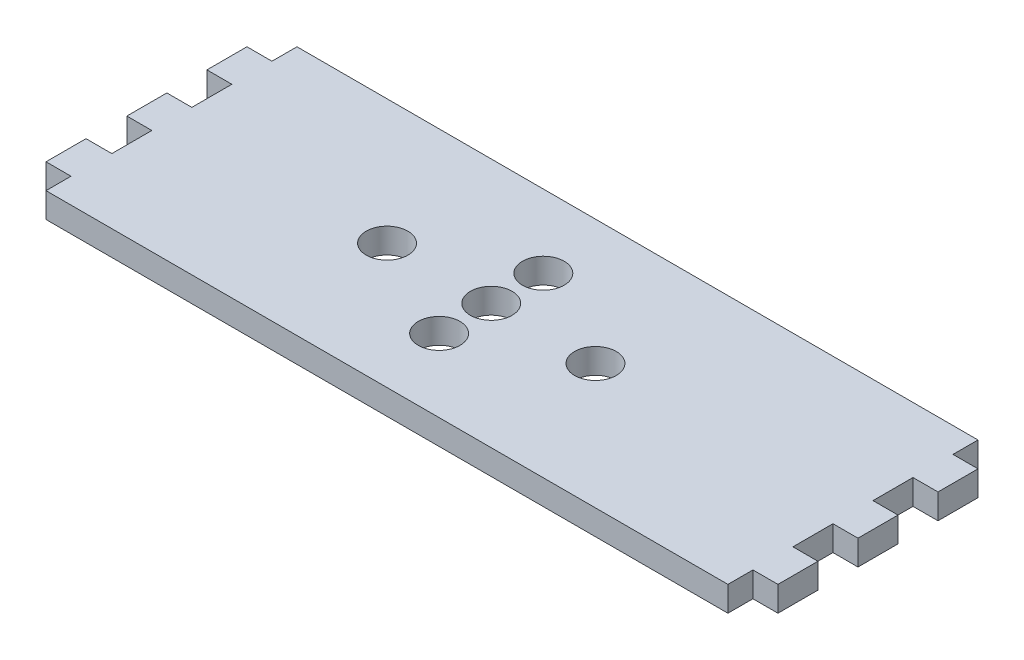
ISO-10303-21;
HEADER;
FILE_DESCRIPTION(('STEP AP214'),'2;1');
FILE_NAME('part.step','',(''),(''),'','','');
FILE_SCHEMA(('AUTOMOTIVE_DESIGN { 1 0 10303 214 1 1 1 1 }'));
ENDSEC;
DATA;
#1=APPLICATION_CONTEXT('core data for automotive mechanical design processes');
#2=APPLICATION_PROTOCOL_DEFINITION('international standard','automotive_design',2000,#1);
#3=PRODUCT_CONTEXT('',#1,'mechanical');
#4=PRODUCT('Part','Part','',(#3));
#5=PRODUCT_RELATED_PRODUCT_CATEGORY('part','',(#4));
#6=PRODUCT_DEFINITION_FORMATION('','',#4);
#7=PRODUCT_DEFINITION_CONTEXT('part definition',#1,'design');
#8=PRODUCT_DEFINITION('design','',#6,#7);
#9=PRODUCT_DEFINITION_SHAPE('','',#8);
#10=(LENGTH_UNIT() NAMED_UNIT(*) SI_UNIT(.MILLI.,.METRE.));
#11=(NAMED_UNIT(*) PLANE_ANGLE_UNIT() SI_UNIT($,.RADIAN.));
#12=(NAMED_UNIT(*) SI_UNIT($,.STERADIAN.) SOLID_ANGLE_UNIT());
#13=UNCERTAINTY_MEASURE_WITH_UNIT(LENGTH_MEASURE(1.E-05),#10,'distance_accuracy_value','');
#14=(GEOMETRIC_REPRESENTATION_CONTEXT(3) GLOBAL_UNCERTAINTY_ASSIGNED_CONTEXT((#13)) GLOBAL_UNIT_ASSIGNED_CONTEXT((#10,
#11,#12)) REPRESENTATION_CONTEXT('',''));
#15=CARTESIAN_POINT('',(0.,0.,0.));
#16=DIRECTION('',(0.,0.,1.));
#17=DIRECTION('',(1.,0.,0.));
#18=AXIS2_PLACEMENT_3D('',#15,#16,#17);
#19=CARTESIAN_POINT('',(0.,3.,0.));
#20=DIRECTION('',(0.,1.,0.));
#21=DIRECTION('',(0.,0.,1.));
#22=AXIS2_PLACEMENT_3D('',#19,#20,#21);
#23=PLANE('',#22);
#24=CARTESIAN_POINT('',(-16.6212713440349,3.,10.3559258979495));
#25=DIRECTION('',(0.,1.,0.));
#26=DIRECTION('',(0.,0.,1.));
#27=AXIS2_PLACEMENT_3D('',#24,#25,#26);
#28=CIRCLE('',#27,2.5);
#29=CARTESIAN_POINT('',(-16.6212713440349,3.,12.8559258979495));
#30=VERTEX_POINT('',#29);
#31=EDGE_CURVE('E592',#30,#30,#28,.T.);
#32=ORIENTED_EDGE('',*,*,#31,.F.);
#33=EDGE_LOOP('',(#32));
#34=FACE_BOUND('',#33,.T.);
#35=CARTESIAN_POINT('',(-16.6212713440349,3.,-2.14407410205047));
#36=DIRECTION('',(0.,1.,0.));
#37=DIRECTION('',(0.,0.,1.));
#38=AXIS2_PLACEMENT_3D('',#35,#36,#37);
#39=CIRCLE('',#38,2.5);
#40=CARTESIAN_POINT('',(-16.6212713440349,3.,0.355925897949527));
#41=VERTEX_POINT('',#40);
#42=EDGE_CURVE('E608',#41,#41,#39,.T.);
#43=ORIENTED_EDGE('',*,*,#42,.F.);
#44=EDGE_LOOP('',(#43));
#45=FACE_BOUND('',#44,.T.);
#46=DIRECTION('',(0.,0.,1.));
#47=VECTOR('',#46,1.);
#48=CARTESIAN_POINT('',(-57.9249234536885,3.,-7.89384586424679));
#49=LINE('',#48,#47);
#50=CARTESIAN_POINT('',(-57.9249234536885,3.,-7.89384586424679));
#51=VERTEX_POINT('',#50);
#52=CARTESIAN_POINT('',(-57.9249234536885,3.,-3.09384586424679));
#53=VERTEX_POINT('',#52);
#54=EDGE_CURVE('E344',#51,#53,#49,.T.);
#55=ORIENTED_EDGE('',*,*,#54,.T.);
#56=DIRECTION('',(1.,0.,0.));
#57=VECTOR('',#56,1.);
#58=CARTESIAN_POINT('',(-57.9249234536885,3.,-3.09384586424679));
#59=LINE('',#58,#57);
#60=CARTESIAN_POINT('',(-54.9341826975603,3.,-3.09384586424679));
#61=VERTEX_POINT('',#60);
#62=EDGE_CURVE('E160',#53,#61,#59,.T.);
#63=ORIENTED_EDGE('',*,*,#62,.T.);
#64=DIRECTION('',(0.,0.,1.));
#65=VECTOR('',#64,1.);
#66=CARTESIAN_POINT('',(-54.9341826975603,3.,-3.09384586424679));
#67=LINE('',#66,#65);
#68=CARTESIAN_POINT('',(-54.9341826975603,3.,1.70615413575321));
#69=VERTEX_POINT('',#68);
#70=EDGE_CURVE('E445',#61,#69,#67,.T.);
#71=ORIENTED_EDGE('',*,*,#70,.T.);
#72=DIRECTION('',(-1.,0.,0.));
#73=VECTOR('',#72,1.);
#74=CARTESIAN_POINT('',(-54.9341826975603,3.,1.70615413575321));
#75=LINE('',#74,#73);
#76=CARTESIAN_POINT('',(-57.9312240082668,3.,1.70615413575321));
#77=VERTEX_POINT('',#76);
#78=EDGE_CURVE('E465',#69,#77,#75,.T.);
#79=ORIENTED_EDGE('',*,*,#78,.T.);
#80=DIRECTION('',(0.,0.,1.));
#81=VECTOR('',#80,1.);
#82=CARTESIAN_POINT('',(-57.9312240082668,3.,1.70615413575321));
#83=LINE('',#82,#81);
#84=CARTESIAN_POINT('',(-57.9312240082668,3.,6.50615413575321));
#85=VERTEX_POINT('',#84);
#86=EDGE_CURVE('E461',#77,#85,#83,.T.);
#87=ORIENTED_EDGE('',*,*,#86,.T.);
#88=DIRECTION('',(1.,0.,0.));
#89=VECTOR('',#88,1.);
#90=CARTESIAN_POINT('',(-57.9312240082668,3.,6.50615413575321));
#91=LINE('',#90,#89);
#92=CARTESIAN_POINT('',(-54.9312240082669,3.,6.50615413575321));
#93=VERTEX_POINT('',#92);
#94=EDGE_CURVE('E464',#85,#93,#91,.T.);
#95=ORIENTED_EDGE('',*,*,#94,.T.);
#96=DIRECTION('',(0.,0.,1.));
#97=VECTOR('',#96,1.);
#98=CARTESIAN_POINT('',(-54.9312240082669,3.,6.50615413575321));
#99=LINE('',#98,#97);
#100=CARTESIAN_POINT('',(-54.9312240082669,3.,11.3061541357532));
#101=VERTEX_POINT('',#100);
#102=EDGE_CURVE('E469',#93,#101,#99,.T.);
#103=ORIENTED_EDGE('',*,*,#102,.T.);
#104=DIRECTION('',(-1.,0.,0.));
#105=VECTOR('',#104,1.);
#106=CARTESIAN_POINT('',(-54.9312240082669,3.,11.3061541357532));
#107=LINE('',#106,#105);
#108=CARTESIAN_POINT('',(-58.0295913211727,3.,11.3061541357532));
#109=VERTEX_POINT('',#108);
#110=EDGE_CURVE('E476',#101,#109,#107,.T.);
#111=ORIENTED_EDGE('',*,*,#110,.T.);
#112=DIRECTION('',(0.,0.,1.));
#113=VECTOR('',#112,1.);
#114=CARTESIAN_POINT('',(-58.0295913211727,3.,11.3061541357532));
#115=LINE('',#114,#113);
#116=CARTESIAN_POINT('',(-58.0295913211727,3.,16.1059258979495));
#117=VERTEX_POINT('',#116);
#118=EDGE_CURVE('E479',#109,#117,#115,.T.);
#119=ORIENTED_EDGE('',*,*,#118,.T.);
#120=DIRECTION('',(1.,0.,0.));
#121=VECTOR('',#120,1.);
#122=CARTESIAN_POINT('',(-55.0295913211727,3.,16.1059258979495));
#123=LINE('',#122,#121);
#124=CARTESIAN_POINT('',(-55.0295913211727,3.,16.1059258979495));
#125=VERTEX_POINT('',#124);
#126=EDGE_CURVE('E482',#117,#125,#123,.T.);
#127=ORIENTED_EDGE('',*,*,#126,.T.);
#128=DIRECTION('',(0.,0.,1.));
#129=VECTOR('',#128,1.);
#130=CARTESIAN_POINT('',(-55.0295913211727,3.,19.1059258979495));
#131=LINE('',#130,#129);
#132=CARTESIAN_POINT('',(-55.0295913211727,3.,19.1059258979495));
#133=VERTEX_POINT('',#132);
#134=EDGE_CURVE('E485',#125,#133,#131,.T.);
#135=ORIENTED_EDGE('',*,*,#134,.T.);
#136=DIRECTION('',(1.,0.,0.));
#137=VECTOR('',#136,1.);
#138=CARTESIAN_POINT('',(26.7704086788273,3.,19.1059258979495));
#139=LINE('',#138,#137);
#140=CARTESIAN_POINT('',(26.7704086788273,3.,19.1059258979495));
#141=VERTEX_POINT('',#140);
#142=EDGE_CURVE('E488',#133,#141,#139,.T.);
#143=ORIENTED_EDGE('',*,*,#142,.T.);
#144=DIRECTION('',(0.,0.,-1.));
#145=VECTOR('',#144,1.);
#146=CARTESIAN_POINT('',(26.7704086788273,3.,16.1059258979495));
#147=LINE('',#146,#145);
#148=CARTESIAN_POINT('',(26.7704086788273,3.,16.1059258979495));
#149=VERTEX_POINT('',#148);
#150=EDGE_CURVE('E491',#141,#149,#147,.T.);
#151=ORIENTED_EDGE('',*,*,#150,.T.);
#152=DIRECTION('',(1.,0.,0.));
#153=VECTOR('',#152,1.);
#154=CARTESIAN_POINT('',(29.7704086788273,3.,16.1059258979495));
#155=LINE('',#154,#153);
#156=CARTESIAN_POINT('',(29.7704086788273,3.,16.1059258979495));
#157=VERTEX_POINT('',#156);
#158=EDGE_CURVE('E494',#149,#157,#155,.T.);
#159=ORIENTED_EDGE('',*,*,#158,.T.);
#160=DIRECTION('',(0.,0.,-1.));
#161=VECTOR('',#160,1.);
#162=CARTESIAN_POINT('',(29.7704086788273,3.,11.3061541357532));
#163=LINE('',#162,#161);
#164=CARTESIAN_POINT('',(29.7704086788273,3.,11.3061541357532));
#165=VERTEX_POINT('',#164);
#166=EDGE_CURVE('E497',#157,#165,#163,.T.);
#167=ORIENTED_EDGE('',*,*,#166,.T.);
#168=DIRECTION('',(-1.,0.,0.));
#169=VECTOR('',#168,1.);
#170=CARTESIAN_POINT('',(26.7704086788273,3.,11.3061541357532));
#171=LINE('',#170,#169);
#172=CARTESIAN_POINT('',(26.7704086788273,3.,11.3061541357532));
#173=VERTEX_POINT('',#172);
#174=EDGE_CURVE('E500',#165,#173,#171,.T.);
#175=ORIENTED_EDGE('',*,*,#174,.T.);
#176=DIRECTION('',(0.,0.,-1.));
#177=VECTOR('',#176,1.);
#178=CARTESIAN_POINT('',(26.7704086788273,3.,6.50615413575321));
#179=LINE('',#178,#177);
#180=CARTESIAN_POINT('',(26.7704086788273,3.,6.50615413575321));
#181=VERTEX_POINT('',#180);
#182=EDGE_CURVE('E503',#173,#181,#179,.T.);
#183=ORIENTED_EDGE('',*,*,#182,.T.);
#184=DIRECTION('',(1.,0.,0.));
#185=VECTOR('',#184,1.);
#186=CARTESIAN_POINT('',(29.7704086788273,3.,6.50615413575321));
#187=LINE('',#186,#185);
#188=CARTESIAN_POINT('',(29.7704086788273,3.,6.50615413575321));
#189=VERTEX_POINT('',#188);
#190=EDGE_CURVE('E506',#181,#189,#187,.T.);
#191=ORIENTED_EDGE('',*,*,#190,.T.);
#192=DIRECTION('',(0.,0.,-1.));
#193=VECTOR('',#192,1.);
#194=CARTESIAN_POINT('',(29.7704086788273,3.,1.70615413575321));
#195=LINE('',#194,#193);
#196=CARTESIAN_POINT('',(29.7704086788273,3.,1.70615413575321));
#197=VERTEX_POINT('',#196);
#198=EDGE_CURVE('E509',#189,#197,#195,.T.);
#199=ORIENTED_EDGE('',*,*,#198,.T.);
#200=DIRECTION('',(-1.,0.,0.));
#201=VECTOR('',#200,1.);
#202=CARTESIAN_POINT('',(26.7704086788273,3.,1.70615413575321));
#203=LINE('',#202,#201);
#204=CARTESIAN_POINT('',(26.7704086788273,3.,1.70615413575321));
#205=VERTEX_POINT('',#204);
#206=EDGE_CURVE('E512',#197,#205,#203,.T.);
#207=ORIENTED_EDGE('',*,*,#206,.T.);
#208=DIRECTION('',(0.,0.,-1.));
#209=VECTOR('',#208,1.);
#210=CARTESIAN_POINT('',(26.7704086788273,3.,-3.09384586424679));
#211=LINE('',#210,#209);
#212=CARTESIAN_POINT('',(26.7704086788273,3.,-3.09384586424679));
#213=VERTEX_POINT('',#212);
#214=EDGE_CURVE('E515',#205,#213,#211,.T.);
#215=ORIENTED_EDGE('',*,*,#214,.T.);
#216=DIRECTION('',(1.,0.,0.));
#217=VECTOR('',#216,1.);
#218=CARTESIAN_POINT('',(29.7683925013622,3.,-3.09384586424679));
#219=LINE('',#218,#217);
#220=CARTESIAN_POINT('',(29.7683925013622,3.,-3.09384586424679));
#221=VERTEX_POINT('',#220);
#222=EDGE_CURVE('E518',#213,#221,#219,.T.);
#223=ORIENTED_EDGE('',*,*,#222,.T.);
#224=DIRECTION('',(0.,0.,-1.));
#225=VECTOR('',#224,1.);
#226=CARTESIAN_POINT('',(29.7683925013622,3.,-7.89384586424679));
#227=LINE('',#226,#225);
#228=CARTESIAN_POINT('',(29.7683925013622,3.,-7.89384586424679));
#229=VERTEX_POINT('',#228);
#230=EDGE_CURVE('E521',#221,#229,#227,.T.);
#231=ORIENTED_EDGE('',*,*,#230,.T.);
#232=DIRECTION('',(-1.,0.,0.));
#233=VECTOR('',#232,1.);
#234=CARTESIAN_POINT('',(26.7683925013622,3.,-7.89384586424679));
#235=LINE('',#234,#233);
#236=CARTESIAN_POINT('',(26.7683925013622,3.,-7.89384586424679));
#237=VERTEX_POINT('',#236);
#238=EDGE_CURVE('E524',#229,#237,#235,.T.);
#239=ORIENTED_EDGE('',*,*,#238,.T.);
#240=DIRECTION('',(0.,0.,-1.));
#241=VECTOR('',#240,1.);
#242=CARTESIAN_POINT('',(26.7683925013622,3.,-10.8938458642468));
#243=LINE('',#242,#241);
#244=CARTESIAN_POINT('',(26.7683925013622,3.,-10.8938458642468));
#245=VERTEX_POINT('',#244);
#246=EDGE_CURVE('E239',#237,#245,#243,.T.);
#247=ORIENTED_EDGE('',*,*,#246,.T.);
#248=DIRECTION('',(-1.,0.,0.));
#249=VECTOR('',#248,1.);
#250=CARTESIAN_POINT('',(-54.9249234536885,3.,-10.8938458642468));
#251=LINE('',#250,#249);
#252=CARTESIAN_POINT('',(-54.9249234536885,3.,-10.8938458642468));
#253=VERTEX_POINT('',#252);
#254=EDGE_CURVE('E233',#245,#253,#251,.T.);
#255=ORIENTED_EDGE('',*,*,#254,.T.);
#256=DIRECTION('',(0.,0.,1.));
#257=VECTOR('',#256,1.);
#258=CARTESIAN_POINT('',(-54.9249234536885,3.,-7.89384586424679));
#259=LINE('',#258,#257);
#260=CARTESIAN_POINT('',(-54.9249234536885,3.,-7.89384586424679));
#261=VERTEX_POINT('',#260);
#262=EDGE_CURVE('E237',#253,#261,#259,.T.);
#263=ORIENTED_EDGE('',*,*,#262,.T.);
#264=DIRECTION('',(-1.,0.,0.));
#265=VECTOR('',#264,1.);
#266=CARTESIAN_POINT('',(-57.9249234536885,3.,-7.89384586424679));
#267=LINE('',#266,#265);
#268=EDGE_CURVE('E57',#261,#51,#267,.T.);
#269=ORIENTED_EDGE('',*,*,#268,.T.);
#270=EDGE_LOOP('',(#55,#63,#71,#79,#87,#95,#103,#111,#119,#127,#135,#143,#151,#159,#167,#175,
#183,#191,#199,#207,#215,#223,#231,#239,#247,#255,#263,#269));
#271=FACE_BOUND('',#270,.T.);
#272=CARTESIAN_POINT('',(-16.6212713440349,3.,4.10592589794953));
#273=DIRECTION('',(0.,1.,0.));
#274=DIRECTION('',(0.,0.,1.));
#275=AXIS2_PLACEMENT_3D('',#272,#273,#274);
#276=CIRCLE('',#275,2.5);
#277=CARTESIAN_POINT('',(-16.6212713440349,3.,6.60592589794953));
#278=VERTEX_POINT('',#277);
#279=EDGE_CURVE('E266',#278,#278,#276,.T.);
#280=ORIENTED_EDGE('',*,*,#279,.F.);
#281=EDGE_LOOP('',(#280));
#282=FACE_BOUND('',#281,.T.);
#283=CARTESIAN_POINT('',(-4.12127134403486,3.,4.10592589794953));
#284=DIRECTION('',(0.,1.,0.));
#285=DIRECTION('',(0.,0.,1.));
#286=AXIS2_PLACEMENT_3D('',#283,#284,#285);
#287=CIRCLE('',#286,2.49999999723243);
#288=CARTESIAN_POINT('',(-4.12127134403486,3.,6.60592589518195));
#289=VERTEX_POINT('',#288);
#290=EDGE_CURVE('E600',#289,#289,#287,.T.);
#291=ORIENTED_EDGE('',*,*,#290,.F.);
#292=EDGE_LOOP('',(#291));
#293=FACE_BOUND('',#292,.T.);
#294=CARTESIAN_POINT('',(-29.1212713440349,3.,4.10592589794953));
#295=DIRECTION('',(0.,1.,0.));
#296=DIRECTION('',(0.,0.,1.));
#297=AXIS2_PLACEMENT_3D('',#294,#295,#296);
#298=CIRCLE('',#297,2.50000000276757);
#299=CARTESIAN_POINT('',(-29.1212713440349,3.,6.6059259007171));
#300=VERTEX_POINT('',#299);
#301=EDGE_CURVE('E581',#300,#300,#298,.T.);
#302=ORIENTED_EDGE('',*,*,#301,.F.);
#303=EDGE_LOOP('',(#302));
#304=FACE_BOUND('',#303,.T.);
#305=ADVANCED_FACE('F39',(#34,#45,#271,#282,#293,#304),#23,.T.);
#306=CARTESIAN_POINT('',(0.,0.,0.));
#307=DIRECTION('',(0.,1.,0.));
#308=DIRECTION('',(0.,0.,1.));
#309=AXIS2_PLACEMENT_3D('',#306,#307,#308);
#310=PLANE('',#309);
#311=DIRECTION('',(0.,0.,1.));
#312=VECTOR('',#311,1.);
#313=CARTESIAN_POINT('',(-57.9249234536885,0.,-7.89384586424679));
#314=LINE('',#313,#312);
#315=CARTESIAN_POINT('',(-57.9249234536885,0.,-7.89384586424679));
#316=VERTEX_POINT('',#315);
#317=CARTESIAN_POINT('',(-57.9249234536885,0.,-3.09384586424679));
#318=VERTEX_POINT('',#317);
#319=EDGE_CURVE('E261',#316,#318,#314,.T.);
#320=ORIENTED_EDGE('',*,*,#319,.F.);
#321=DIRECTION('',(-1.,0.,0.));
#322=VECTOR('',#321,1.);
#323=CARTESIAN_POINT('',(-57.9249234536885,0.,-7.89384586424679));
#324=LINE('',#323,#322);
#325=CARTESIAN_POINT('',(-54.9249234536885,0.,-7.89384586424679));
#326=VERTEX_POINT('',#325);
#327=EDGE_CURVE('E152',#326,#316,#324,.T.);
#328=ORIENTED_EDGE('',*,*,#327,.F.);
#329=DIRECTION('',(0.,0.,1.));
#330=VECTOR('',#329,1.);
#331=CARTESIAN_POINT('',(-54.9249234536885,0.,-7.89384586424679));
#332=LINE('',#331,#330);
#333=CARTESIAN_POINT('',(-54.9249234536885,0.,-10.8938458642468));
#334=VERTEX_POINT('',#333);
#335=EDGE_CURVE('E146',#334,#326,#332,.T.);
#336=ORIENTED_EDGE('',*,*,#335,.F.);
#337=DIRECTION('',(-1.,0.,0.));
#338=VECTOR('',#337,1.);
#339=CARTESIAN_POINT('',(-54.9249234536885,0.,-10.8938458642468));
#340=LINE('',#339,#338);
#341=CARTESIAN_POINT('',(26.7683925013622,0.,-10.8938458642468));
#342=VERTEX_POINT('',#341);
#343=EDGE_CURVE('E248',#342,#334,#340,.T.);
#344=ORIENTED_EDGE('',*,*,#343,.F.);
#345=DIRECTION('',(0.,0.,-1.));
#346=VECTOR('',#345,1.);
#347=CARTESIAN_POINT('',(26.7683925013622,0.,-10.8938458642468));
#348=LINE('',#347,#346);
#349=CARTESIAN_POINT('',(26.7683925013622,0.,-7.89384586424679));
#350=VERTEX_POINT('',#349);
#351=EDGE_CURVE('E335',#350,#342,#348,.T.);
#352=ORIENTED_EDGE('',*,*,#351,.F.);
#353=DIRECTION('',(-1.,0.,0.));
#354=VECTOR('',#353,1.);
#355=CARTESIAN_POINT('',(26.7683925013622,0.,-7.89384586424679));
#356=LINE('',#355,#354);
#357=CARTESIAN_POINT('',(29.7683925013622,0.,-7.89384586424679));
#358=VERTEX_POINT('',#357);
#359=EDGE_CURVE('E332',#358,#350,#356,.T.);
#360=ORIENTED_EDGE('',*,*,#359,.F.);
#361=DIRECTION('',(0.,0.,-1.));
#362=VECTOR('',#361,1.);
#363=CARTESIAN_POINT('',(29.7683925013622,0.,-7.89384586424679));
#364=LINE('',#363,#362);
#365=CARTESIAN_POINT('',(29.7683925013622,0.,-3.09384586424679));
#366=VERTEX_POINT('',#365);
#367=EDGE_CURVE('E329',#366,#358,#364,.T.);
#368=ORIENTED_EDGE('',*,*,#367,.F.);
#369=DIRECTION('',(1.,0.,0.));
#370=VECTOR('',#369,1.);
#371=CARTESIAN_POINT('',(29.7683925013622,0.,-3.09384586424679));
#372=LINE('',#371,#370);
#373=CARTESIAN_POINT('',(26.7704086788273,0.,-3.09384586424679));
#374=VERTEX_POINT('',#373);
#375=EDGE_CURVE('E326',#374,#366,#372,.T.);
#376=ORIENTED_EDGE('',*,*,#375,.F.);
#377=DIRECTION('',(0.,0.,-1.));
#378=VECTOR('',#377,1.);
#379=CARTESIAN_POINT('',(26.7704086788273,0.,-3.09384586424679));
#380=LINE('',#379,#378);
#381=CARTESIAN_POINT('',(26.7704086788273,0.,1.70615413575321));
#382=VERTEX_POINT('',#381);
#383=EDGE_CURVE('E323',#382,#374,#380,.T.);
#384=ORIENTED_EDGE('',*,*,#383,.F.);
#385=DIRECTION('',(-1.,0.,0.));
#386=VECTOR('',#385,1.);
#387=CARTESIAN_POINT('',(26.7704086788273,0.,1.70615413575321));
#388=LINE('',#387,#386);
#389=CARTESIAN_POINT('',(29.7704086788273,0.,1.70615413575321));
#390=VERTEX_POINT('',#389);
#391=EDGE_CURVE('E320',#390,#382,#388,.T.);
#392=ORIENTED_EDGE('',*,*,#391,.F.);
#393=DIRECTION('',(0.,0.,-1.));
#394=VECTOR('',#393,1.);
#395=CARTESIAN_POINT('',(29.7704086788273,0.,1.70615413575321));
#396=LINE('',#395,#394);
#397=CARTESIAN_POINT('',(29.7704086788273,0.,6.50615413575321));
#398=VERTEX_POINT('',#397);
#399=EDGE_CURVE('E317',#398,#390,#396,.T.);
#400=ORIENTED_EDGE('',*,*,#399,.F.);
#401=DIRECTION('',(1.,0.,0.));
#402=VECTOR('',#401,1.);
#403=CARTESIAN_POINT('',(29.7704086788273,0.,6.50615413575321));
#404=LINE('',#403,#402);
#405=CARTESIAN_POINT('',(26.7704086788273,0.,6.50615413575321));
#406=VERTEX_POINT('',#405);
#407=EDGE_CURVE('E314',#406,#398,#404,.T.);
#408=ORIENTED_EDGE('',*,*,#407,.F.);
#409=DIRECTION('',(0.,0.,-1.));
#410=VECTOR('',#409,1.);
#411=CARTESIAN_POINT('',(26.7704086788273,0.,6.50615413575321));
#412=LINE('',#411,#410);
#413=CARTESIAN_POINT('',(26.7704086788273,0.,11.3061541357532));
#414=VERTEX_POINT('',#413);
#415=EDGE_CURVE('E311',#414,#406,#412,.T.);
#416=ORIENTED_EDGE('',*,*,#415,.F.);
#417=DIRECTION('',(-1.,0.,0.));
#418=VECTOR('',#417,1.);
#419=CARTESIAN_POINT('',(26.7704086788273,0.,11.3061541357532));
#420=LINE('',#419,#418);
#421=CARTESIAN_POINT('',(29.7704086788273,0.,11.3061541357532));
#422=VERTEX_POINT('',#421);
#423=EDGE_CURVE('E308',#422,#414,#420,.T.);
#424=ORIENTED_EDGE('',*,*,#423,.F.);
#425=DIRECTION('',(0.,0.,-1.));
#426=VECTOR('',#425,1.);
#427=CARTESIAN_POINT('',(29.7704086788273,0.,11.3061541357532));
#428=LINE('',#427,#426);
#429=CARTESIAN_POINT('',(29.7704086788273,0.,16.1059258979495));
#430=VERTEX_POINT('',#429);
#431=EDGE_CURVE('E305',#430,#422,#428,.T.);
#432=ORIENTED_EDGE('',*,*,#431,.F.);
#433=DIRECTION('',(1.,0.,0.));
#434=VECTOR('',#433,1.);
#435=CARTESIAN_POINT('',(29.7704086788273,0.,16.1059258979495));
#436=LINE('',#435,#434);
#437=CARTESIAN_POINT('',(26.7704086788273,0.,16.1059258979495));
#438=VERTEX_POINT('',#437);
#439=EDGE_CURVE('E302',#438,#430,#436,.T.);
#440=ORIENTED_EDGE('',*,*,#439,.F.);
#441=DIRECTION('',(0.,0.,-1.));
#442=VECTOR('',#441,1.);
#443=CARTESIAN_POINT('',(26.7704086788273,0.,16.1059258979495));
#444=LINE('',#443,#442);
#445=CARTESIAN_POINT('',(26.7704086788273,0.,19.1059258979495));
#446=VERTEX_POINT('',#445);
#447=EDGE_CURVE('E299',#446,#438,#444,.T.);
#448=ORIENTED_EDGE('',*,*,#447,.F.);
#449=DIRECTION('',(1.,0.,0.));
#450=VECTOR('',#449,1.);
#451=CARTESIAN_POINT('',(26.7704086788273,0.,19.1059258979495));
#452=LINE('',#451,#450);
#453=CARTESIAN_POINT('',(-55.0295913211727,0.,19.1059258979495));
#454=VERTEX_POINT('',#453);
#455=EDGE_CURVE('E296',#454,#446,#452,.T.);
#456=ORIENTED_EDGE('',*,*,#455,.F.);
#457=DIRECTION('',(0.,0.,1.));
#458=VECTOR('',#457,1.);
#459=CARTESIAN_POINT('',(-55.0295913211727,0.,19.1059258979495));
#460=LINE('',#459,#458);
#461=CARTESIAN_POINT('',(-55.0295913211727,0.,16.1059258979495));
#462=VERTEX_POINT('',#461);
#463=EDGE_CURVE('E293',#462,#454,#460,.T.);
#464=ORIENTED_EDGE('',*,*,#463,.F.);
#465=DIRECTION('',(1.,0.,0.));
#466=VECTOR('',#465,1.);
#467=CARTESIAN_POINT('',(-55.0295913211727,0.,16.1059258979495));
#468=LINE('',#467,#466);
#469=CARTESIAN_POINT('',(-58.0295913211727,0.,16.1059258979495));
#470=VERTEX_POINT('',#469);
#471=EDGE_CURVE('E290',#470,#462,#468,.T.);
#472=ORIENTED_EDGE('',*,*,#471,.F.);
#473=DIRECTION('',(0.,0.,1.));
#474=VECTOR('',#473,1.);
#475=CARTESIAN_POINT('',(-58.0295913211727,0.,11.3061541357532));
#476=LINE('',#475,#474);
#477=CARTESIAN_POINT('',(-58.0295913211727,0.,11.3061541357532));
#478=VERTEX_POINT('',#477);
#479=EDGE_CURVE('E287',#478,#470,#476,.T.);
#480=ORIENTED_EDGE('',*,*,#479,.F.);
#481=DIRECTION('',(-1.,0.,0.));
#482=VECTOR('',#481,1.);
#483=CARTESIAN_POINT('',(-54.9312240082669,0.,11.3061541357532));
#484=LINE('',#483,#482);
#485=CARTESIAN_POINT('',(-54.9312240082669,0.,11.3061541357532));
#486=VERTEX_POINT('',#485);
#487=EDGE_CURVE('E284',#486,#478,#484,.T.);
#488=ORIENTED_EDGE('',*,*,#487,.F.);
#489=DIRECTION('',(0.,0.,1.));
#490=VECTOR('',#489,1.);
#491=CARTESIAN_POINT('',(-54.9312240082669,0.,6.50615413575321));
#492=LINE('',#491,#490);
#493=CARTESIAN_POINT('',(-54.9312240082669,0.,6.50615413575321));
#494=VERTEX_POINT('',#493);
#495=EDGE_CURVE('E281',#494,#486,#492,.T.);
#496=ORIENTED_EDGE('',*,*,#495,.F.);
#497=DIRECTION('',(1.,0.,0.));
#498=VECTOR('',#497,1.);
#499=CARTESIAN_POINT('',(-57.9312240082668,0.,6.50615413575321));
#500=LINE('',#499,#498);
#501=CARTESIAN_POINT('',(-57.9312240082668,0.,6.50615413575321));
#502=VERTEX_POINT('',#501);
#503=EDGE_CURVE('E278',#502,#494,#500,.T.);
#504=ORIENTED_EDGE('',*,*,#503,.F.);
#505=DIRECTION('',(0.,0.,1.));
#506=VECTOR('',#505,1.);
#507=CARTESIAN_POINT('',(-57.9312240082668,0.,1.70615413575321));
#508=LINE('',#507,#506);
#509=CARTESIAN_POINT('',(-57.9312240082668,0.,1.70615413575321));
#510=VERTEX_POINT('',#509);
#511=EDGE_CURVE('E275',#510,#502,#508,.T.);
#512=ORIENTED_EDGE('',*,*,#511,.F.);
#513=DIRECTION('',(-1.,0.,0.));
#514=VECTOR('',#513,1.);
#515=CARTESIAN_POINT('',(-54.9341826975603,0.,1.70615413575321));
#516=LINE('',#515,#514);
#517=CARTESIAN_POINT('',(-54.9341826975603,0.,1.70615413575321));
#518=VERTEX_POINT('',#517);
#519=EDGE_CURVE('E272',#518,#510,#516,.T.);
#520=ORIENTED_EDGE('',*,*,#519,.F.);
#521=DIRECTION('',(0.,0.,1.));
#522=VECTOR('',#521,1.);
#523=CARTESIAN_POINT('',(-54.9341826975603,0.,-3.09384586424679));
#524=LINE('',#523,#522);
#525=CARTESIAN_POINT('',(-54.9341826975603,0.,-3.09384586424679));
#526=VERTEX_POINT('',#525);
#527=EDGE_CURVE('E269',#526,#518,#524,.T.);
#528=ORIENTED_EDGE('',*,*,#527,.F.);
#529=DIRECTION('',(1.,0.,0.));
#530=VECTOR('',#529,1.);
#531=CARTESIAN_POINT('',(-57.9249234536885,0.,-3.09384586424679));
#532=LINE('',#531,#530);
#533=EDGE_CURVE('E265',#318,#526,#532,.T.);
#534=ORIENTED_EDGE('',*,*,#533,.F.);
#535=EDGE_LOOP('',(#320,#328,#336,#344,#352,#360,#368,#376,#384,#392,#400,#408,#416,#424,#432,
#440,#448,#456,#464,#472,#480,#488,#496,#504,#512,#520,#528,#534));
#536=FACE_BOUND('',#535,.T.);
#537=CARTESIAN_POINT('',(-16.6212713440349,0.,4.10592589794953));
#538=DIRECTION('',(0.,1.,0.));
#539=DIRECTION('',(0.,0.,1.));
#540=AXIS2_PLACEMENT_3D('',#537,#538,#539);
#541=CIRCLE('',#540,2.5);
#542=CARTESIAN_POINT('',(-16.6212713440349,0.,6.60592589794953));
#543=VERTEX_POINT('',#542);
#544=EDGE_CURVE('E612',#543,#543,#541,.T.);
#545=ORIENTED_EDGE('',*,*,#544,.T.);
#546=EDGE_LOOP('',(#545));
#547=FACE_BOUND('',#546,.T.);
#548=CARTESIAN_POINT('',(-16.6212713440349,0.,-2.14407410205047));
#549=DIRECTION('',(0.,1.,0.));
#550=DIRECTION('',(0.,0.,1.));
#551=AXIS2_PLACEMENT_3D('',#548,#549,#550);
#552=CIRCLE('',#551,2.5);
#553=CARTESIAN_POINT('',(-16.6212713440349,0.,0.355925897949527));
#554=VERTEX_POINT('',#553);
#555=EDGE_CURVE('E604',#554,#554,#552,.T.);
#556=ORIENTED_EDGE('',*,*,#555,.T.);
#557=EDGE_LOOP('',(#556));
#558=FACE_BOUND('',#557,.T.);
#559=CARTESIAN_POINT('',(-4.12127134403486,0.,4.10592589794953));
#560=DIRECTION('',(0.,1.,0.));
#561=DIRECTION('',(0.,0.,1.));
#562=AXIS2_PLACEMENT_3D('',#559,#560,#561);
#563=CIRCLE('',#562,2.49999999723243);
#564=CARTESIAN_POINT('',(-4.12127134403486,0.,6.60592589518195));
#565=VERTEX_POINT('',#564);
#566=EDGE_CURVE('E596',#565,#565,#563,.T.);
#567=ORIENTED_EDGE('',*,*,#566,.T.);
#568=EDGE_LOOP('',(#567));
#569=FACE_BOUND('',#568,.T.);
#570=CARTESIAN_POINT('',(-16.6212713440349,0.,10.3559258979495));
#571=DIRECTION('',(0.,1.,0.));
#572=DIRECTION('',(0.,0.,1.));
#573=AXIS2_PLACEMENT_3D('',#570,#571,#572);
#574=CIRCLE('',#573,2.5);
#575=CARTESIAN_POINT('',(-16.6212713440349,0.,12.8559258979495));
#576=VERTEX_POINT('',#575);
#577=EDGE_CURVE('E589',#576,#576,#574,.T.);
#578=ORIENTED_EDGE('',*,*,#577,.T.);
#579=EDGE_LOOP('',(#578));
#580=FACE_BOUND('',#579,.T.);
#581=CARTESIAN_POINT('',(-29.1212713440349,0.,4.10592589794953));
#582=DIRECTION('',(0.,1.,0.));
#583=DIRECTION('',(0.,0.,1.));
#584=AXIS2_PLACEMENT_3D('',#581,#582,#583);
#585=CIRCLE('',#584,2.50000000276757);
#586=CARTESIAN_POINT('',(-29.1212713440349,0.,6.6059259007171));
#587=VERTEX_POINT('',#586);
#588=EDGE_CURVE('E584',#587,#587,#585,.T.);
#589=ORIENTED_EDGE('',*,*,#588,.T.);
#590=EDGE_LOOP('',(#589));
#591=FACE_BOUND('',#590,.T.);
#592=ADVANCED_FACE('F449',(#536,#547,#558,#569,#580,#591),#310,.F.);
#593=CARTESIAN_POINT('',(-57.9249234536885,3.,-7.89384586424679));
#594=DIRECTION('',(1.,0.,0.));
#595=DIRECTION('',(0.,0.,-1.));
#596=AXIS2_PLACEMENT_3D('',#593,#594,#595);
#597=PLANE('',#596);
#598=ORIENTED_EDGE('',*,*,#319,.T.);
#599=DIRECTION('',(0.,-1.,0.));
#600=VECTOR('',#599,1.);
#601=CARTESIAN_POINT('',(-57.9249234536885,3.,-3.09384586424679));
#602=LINE('',#601,#600);
#603=EDGE_CURVE('E11',#53,#318,#602,.T.);
#604=ORIENTED_EDGE('',*,*,#603,.F.);
#605=ORIENTED_EDGE('',*,*,#54,.F.);
#606=DIRECTION('',(0.,-1.,0.));
#607=VECTOR('',#606,1.);
#608=CARTESIAN_POINT('',(-57.9249234536885,3.,-7.89384586424679));
#609=LINE('',#608,#607);
#610=EDGE_CURVE('E257',#51,#316,#609,.T.);
#611=ORIENTED_EDGE('',*,*,#610,.T.);
#612=EDGE_LOOP('',(#598,#604,#605,#611));
#613=FACE_BOUND('',#612,.T.);
#614=ADVANCED_FACE('F41',(#613),#597,.F.);
#615=CARTESIAN_POINT('',(-57.9249234536885,3.,-3.09384586424679));
#616=DIRECTION('',(0.,0.,-1.));
#617=DIRECTION('',(-1.,0.,0.));
#618=AXIS2_PLACEMENT_3D('',#615,#616,#617);
#619=PLANE('',#618);
#620=ORIENTED_EDGE('',*,*,#533,.T.);
#621=DIRECTION('',(0.,-1.,0.));
#622=VECTOR('',#621,1.);
#623=CARTESIAN_POINT('',(-54.9341826975603,3.,-3.09384586424679));
#624=LINE('',#623,#622);
#625=EDGE_CURVE('E49',#61,#526,#624,.T.);
#626=ORIENTED_EDGE('',*,*,#625,.F.);
#627=ORIENTED_EDGE('',*,*,#62,.F.);
#628=ORIENTED_EDGE('',*,*,#603,.T.);
#629=EDGE_LOOP('',(#620,#626,#627,#628));
#630=FACE_BOUND('',#629,.T.);
#631=ADVANCED_FACE('F897',(#630),#619,.F.);
#632=CARTESIAN_POINT('',(-54.9341826975603,3.,-3.09384586424679));
#633=DIRECTION('',(1.,0.,0.));
#634=DIRECTION('',(0.,0.,-1.));
#635=AXIS2_PLACEMENT_3D('',#632,#633,#634);
#636=PLANE('',#635);
#637=ORIENTED_EDGE('',*,*,#527,.T.);
#638=DIRECTION('',(0.,-1.,0.));
#639=VECTOR('',#638,1.);
#640=CARTESIAN_POINT('',(-54.9341826975603,3.,1.70615413575321));
#641=LINE('',#640,#639);
#642=EDGE_CURVE('E435',#69,#518,#641,.T.);
#643=ORIENTED_EDGE('',*,*,#642,.F.);
#644=ORIENTED_EDGE('',*,*,#70,.F.);
#645=ORIENTED_EDGE('',*,*,#625,.T.);
#646=EDGE_LOOP('',(#637,#643,#644,#645));
#647=FACE_BOUND('',#646,.T.);
#648=ADVANCED_FACE('F443',(#647),#636,.F.);
#649=CARTESIAN_POINT('',(-54.9341826975603,3.,1.70615413575321));
#650=DIRECTION('',(0.,0.,1.));
#651=DIRECTION('',(1.,0.,0.));
#652=AXIS2_PLACEMENT_3D('',#649,#650,#651);
#653=PLANE('',#652);
#654=ORIENTED_EDGE('',*,*,#519,.T.);
#655=DIRECTION('',(0.,-1.,0.));
#656=VECTOR('',#655,1.);
#657=CARTESIAN_POINT('',(-57.9312240082668,3.,1.70615413575321));
#658=LINE('',#657,#656);
#659=EDGE_CURVE('E431',#77,#510,#658,.T.);
#660=ORIENTED_EDGE('',*,*,#659,.F.);
#661=ORIENTED_EDGE('',*,*,#78,.F.);
#662=ORIENTED_EDGE('',*,*,#642,.T.);
#663=EDGE_LOOP('',(#654,#660,#661,#662));
#664=FACE_BOUND('',#663,.T.);
#665=ADVANCED_FACE('F455',(#664),#653,.F.);
#666=CARTESIAN_POINT('',(-57.9312240082668,3.,1.70615413575321));
#667=DIRECTION('',(1.,0.,0.));
#668=DIRECTION('',(0.,0.,-1.));
#669=AXIS2_PLACEMENT_3D('',#666,#667,#668);
#670=PLANE('',#669);
#671=ORIENTED_EDGE('',*,*,#511,.T.);
#672=DIRECTION('',(0.,-1.,0.));
#673=VECTOR('',#672,1.);
#674=CARTESIAN_POINT('',(-57.9312240082668,3.,6.50615413575321));
#675=LINE('',#674,#673);
#676=EDGE_CURVE('E427',#85,#502,#675,.T.);
#677=ORIENTED_EDGE('',*,*,#676,.F.);
#678=ORIENTED_EDGE('',*,*,#86,.F.);
#679=ORIENTED_EDGE('',*,*,#659,.T.);
#680=EDGE_LOOP('',(#671,#677,#678,#679));
#681=FACE_BOUND('',#680,.T.);
#682=ADVANCED_FACE('F459',(#681),#670,.F.);
#683=CARTESIAN_POINT('',(-57.9312240082668,3.,6.50615413575321));
#684=DIRECTION('',(0.,0.,-1.));
#685=DIRECTION('',(-1.,0.,0.));
#686=AXIS2_PLACEMENT_3D('',#683,#684,#685);
#687=PLANE('',#686);
#688=ORIENTED_EDGE('',*,*,#503,.T.);
#689=DIRECTION('',(0.,-1.,0.));
#690=VECTOR('',#689,1.);
#691=CARTESIAN_POINT('',(-54.9312240082669,3.,6.50615413575321));
#692=LINE('',#691,#690);
#693=EDGE_CURVE('E423',#93,#494,#692,.T.);
#694=ORIENTED_EDGE('',*,*,#693,.F.);
#695=ORIENTED_EDGE('',*,*,#94,.F.);
#696=ORIENTED_EDGE('',*,*,#676,.T.);
#697=EDGE_LOOP('',(#688,#694,#695,#696));
#698=FACE_BOUND('',#697,.T.);
#699=ADVANCED_FACE('F862',(#698),#687,.F.);
#700=CARTESIAN_POINT('',(-54.9312240082669,3.,6.50615413575321));
#701=DIRECTION('',(1.,0.,0.));
#702=DIRECTION('',(0.,0.,-1.));
#703=AXIS2_PLACEMENT_3D('',#700,#701,#702);
#704=PLANE('',#703);
#705=ORIENTED_EDGE('',*,*,#495,.T.);
#706=DIRECTION('',(0.,-1.,0.));
#707=VECTOR('',#706,1.);
#708=CARTESIAN_POINT('',(-54.9312240082669,3.,11.3061541357532));
#709=LINE('',#708,#707);
#710=EDGE_CURVE('E419',#101,#486,#709,.T.);
#711=ORIENTED_EDGE('',*,*,#710,.F.);
#712=ORIENTED_EDGE('',*,*,#102,.F.);
#713=ORIENTED_EDGE('',*,*,#693,.T.);
#714=EDGE_LOOP('',(#705,#711,#712,#713));
#715=FACE_BOUND('',#714,.T.);
#716=ADVANCED_FACE('F852',(#715),#704,.F.);
#717=CARTESIAN_POINT('',(-54.9312240082669,3.,11.3061541357532));
#718=DIRECTION('',(0.,0.,1.));
#719=DIRECTION('',(1.,0.,0.));
#720=AXIS2_PLACEMENT_3D('',#717,#718,#719);
#721=PLANE('',#720);
#722=ORIENTED_EDGE('',*,*,#487,.T.);
#723=DIRECTION('',(0.,-1.,0.));
#724=VECTOR('',#723,1.);
#725=CARTESIAN_POINT('',(-58.0295913211727,3.,11.3061541357532));
#726=LINE('',#725,#724);
#727=EDGE_CURVE('E415',#109,#478,#726,.T.);
#728=ORIENTED_EDGE('',*,*,#727,.F.);
#729=ORIENTED_EDGE('',*,*,#110,.F.);
#730=ORIENTED_EDGE('',*,*,#710,.T.);
#731=EDGE_LOOP('',(#722,#728,#729,#730));
#732=FACE_BOUND('',#731,.T.);
#733=ADVANCED_FACE('F842',(#732),#721,.F.);
#734=CARTESIAN_POINT('',(-58.0295913211727,3.,11.3061541357532));
#735=DIRECTION('',(1.,0.,0.));
#736=DIRECTION('',(0.,0.,-1.));
#737=AXIS2_PLACEMENT_3D('',#734,#735,#736);
#738=PLANE('',#737);
#739=ORIENTED_EDGE('',*,*,#479,.T.);
#740=DIRECTION('',(0.,-1.,0.));
#741=VECTOR('',#740,1.);
#742=CARTESIAN_POINT('',(-58.0295913211727,3.,16.1059258979495));
#743=LINE('',#742,#741);
#744=EDGE_CURVE('E411',#117,#470,#743,.T.);
#745=ORIENTED_EDGE('',*,*,#744,.F.);
#746=ORIENTED_EDGE('',*,*,#118,.F.);
#747=ORIENTED_EDGE('',*,*,#727,.T.);
#748=EDGE_LOOP('',(#739,#745,#746,#747));
#749=FACE_BOUND('',#748,.T.);
#750=ADVANCED_FACE('F832',(#749),#738,.F.);
#751=CARTESIAN_POINT('',(-55.0295913211727,3.,16.1059258979495));
#752=DIRECTION('',(0.,0.,-1.));
#753=DIRECTION('',(-1.,0.,0.));
#754=AXIS2_PLACEMENT_3D('',#751,#752,#753);
#755=PLANE('',#754);
#756=ORIENTED_EDGE('',*,*,#471,.T.);
#757=DIRECTION('',(0.,-1.,0.));
#758=VECTOR('',#757,1.);
#759=CARTESIAN_POINT('',(-55.0295913211727,3.,16.1059258979495));
#760=LINE('',#759,#758);
#761=EDGE_CURVE('E407',#125,#462,#760,.T.);
#762=ORIENTED_EDGE('',*,*,#761,.F.);
#763=ORIENTED_EDGE('',*,*,#126,.F.);
#764=ORIENTED_EDGE('',*,*,#744,.T.);
#765=EDGE_LOOP('',(#756,#762,#763,#764));
#766=FACE_BOUND('',#765,.T.);
#767=ADVANCED_FACE('F822',(#766),#755,.F.);
#768=CARTESIAN_POINT('',(-55.0295913211727,3.,19.1059258979495));
#769=DIRECTION('',(1.,0.,0.));
#770=DIRECTION('',(0.,0.,-1.));
#771=AXIS2_PLACEMENT_3D('',#768,#769,#770);
#772=PLANE('',#771);
#773=ORIENTED_EDGE('',*,*,#463,.T.);
#774=DIRECTION('',(0.,-1.,0.));
#775=VECTOR('',#774,1.);
#776=CARTESIAN_POINT('',(-55.0295913211727,3.,19.1059258979495));
#777=LINE('',#776,#775);
#778=EDGE_CURVE('E403',#133,#454,#777,.T.);
#779=ORIENTED_EDGE('',*,*,#778,.F.);
#780=ORIENTED_EDGE('',*,*,#134,.F.);
#781=ORIENTED_EDGE('',*,*,#761,.T.);
#782=EDGE_LOOP('',(#773,#779,#780,#781));
#783=FACE_BOUND('',#782,.T.);
#784=ADVANCED_FACE('F812',(#783),#772,.F.);
#785=CARTESIAN_POINT('',(26.7704086788273,3.,19.1059258979495));
#786=DIRECTION('',(0.,0.,-1.));
#787=DIRECTION('',(-1.,0.,0.));
#788=AXIS2_PLACEMENT_3D('',#785,#786,#787);
#789=PLANE('',#788);
#790=ORIENTED_EDGE('',*,*,#455,.T.);
#791=DIRECTION('',(0.,-1.,0.));
#792=VECTOR('',#791,1.);
#793=CARTESIAN_POINT('',(26.7704086788273,3.,19.1059258979495));
#794=LINE('',#793,#792);
#795=EDGE_CURVE('E399',#141,#446,#794,.T.);
#796=ORIENTED_EDGE('',*,*,#795,.F.);
#797=ORIENTED_EDGE('',*,*,#142,.F.);
#798=ORIENTED_EDGE('',*,*,#778,.T.);
#799=EDGE_LOOP('',(#790,#796,#797,#798));
#800=FACE_BOUND('',#799,.T.);
#801=ADVANCED_FACE('F802',(#800),#789,.F.);
#802=CARTESIAN_POINT('',(26.7704086788273,3.,16.1059258979495));
#803=DIRECTION('',(-1.,0.,0.));
#804=DIRECTION('',(0.,0.,1.));
#805=AXIS2_PLACEMENT_3D('',#802,#803,#804);
#806=PLANE('',#805);
#807=ORIENTED_EDGE('',*,*,#447,.T.);
#808=DIRECTION('',(0.,-1.,0.));
#809=VECTOR('',#808,1.);
#810=CARTESIAN_POINT('',(26.7704086788273,3.,16.1059258979495));
#811=LINE('',#810,#809);
#812=EDGE_CURVE('E395',#149,#438,#811,.T.);
#813=ORIENTED_EDGE('',*,*,#812,.F.);
#814=ORIENTED_EDGE('',*,*,#150,.F.);
#815=ORIENTED_EDGE('',*,*,#795,.T.);
#816=EDGE_LOOP('',(#807,#813,#814,#815));
#817=FACE_BOUND('',#816,.T.);
#818=ADVANCED_FACE('F792',(#817),#806,.F.);
#819=CARTESIAN_POINT('',(29.7704086788273,3.,16.1059258979495));
#820=DIRECTION('',(0.,0.,-1.));
#821=DIRECTION('',(-1.,0.,0.));
#822=AXIS2_PLACEMENT_3D('',#819,#820,#821);
#823=PLANE('',#822);
#824=ORIENTED_EDGE('',*,*,#439,.T.);
#825=DIRECTION('',(0.,-1.,0.));
#826=VECTOR('',#825,1.);
#827=CARTESIAN_POINT('',(29.7704086788273,3.,16.1059258979495));
#828=LINE('',#827,#826);
#829=EDGE_CURVE('E391',#157,#430,#828,.T.);
#830=ORIENTED_EDGE('',*,*,#829,.F.);
#831=ORIENTED_EDGE('',*,*,#158,.F.);
#832=ORIENTED_EDGE('',*,*,#812,.T.);
#833=EDGE_LOOP('',(#824,#830,#831,#832));
#834=FACE_BOUND('',#833,.T.);
#835=ADVANCED_FACE('F782',(#834),#823,.F.);
#836=CARTESIAN_POINT('',(29.7704086788273,3.,11.3061541357532));
#837=DIRECTION('',(-1.,0.,0.));
#838=DIRECTION('',(0.,0.,1.));
#839=AXIS2_PLACEMENT_3D('',#836,#837,#838);
#840=PLANE('',#839);
#841=ORIENTED_EDGE('',*,*,#431,.T.);
#842=DIRECTION('',(0.,-1.,0.));
#843=VECTOR('',#842,1.);
#844=CARTESIAN_POINT('',(29.7704086788273,3.,11.3061541357532));
#845=LINE('',#844,#843);
#846=EDGE_CURVE('E387',#165,#422,#845,.T.);
#847=ORIENTED_EDGE('',*,*,#846,.F.);
#848=ORIENTED_EDGE('',*,*,#166,.F.);
#849=ORIENTED_EDGE('',*,*,#829,.T.);
#850=EDGE_LOOP('',(#841,#847,#848,#849));
#851=FACE_BOUND('',#850,.T.);
#852=ADVANCED_FACE('F772',(#851),#840,.F.);
#853=CARTESIAN_POINT('',(26.7704086788273,3.,11.3061541357532));
#854=DIRECTION('',(0.,0.,1.));
#855=DIRECTION('',(1.,0.,0.));
#856=AXIS2_PLACEMENT_3D('',#853,#854,#855);
#857=PLANE('',#856);
#858=ORIENTED_EDGE('',*,*,#423,.T.);
#859=DIRECTION('',(0.,-1.,0.));
#860=VECTOR('',#859,1.);
#861=CARTESIAN_POINT('',(26.7704086788273,3.,11.3061541357532));
#862=LINE('',#861,#860);
#863=EDGE_CURVE('E383',#173,#414,#862,.T.);
#864=ORIENTED_EDGE('',*,*,#863,.F.);
#865=ORIENTED_EDGE('',*,*,#174,.F.);
#866=ORIENTED_EDGE('',*,*,#846,.T.);
#867=EDGE_LOOP('',(#858,#864,#865,#866));
#868=FACE_BOUND('',#867,.T.);
#869=ADVANCED_FACE('F762',(#868),#857,.F.);
#870=CARTESIAN_POINT('',(26.7704086788273,3.,6.50615413575321));
#871=DIRECTION('',(-1.,0.,0.));
#872=DIRECTION('',(0.,0.,1.));
#873=AXIS2_PLACEMENT_3D('',#870,#871,#872);
#874=PLANE('',#873);
#875=ORIENTED_EDGE('',*,*,#415,.T.);
#876=DIRECTION('',(0.,-1.,0.));
#877=VECTOR('',#876,1.);
#878=CARTESIAN_POINT('',(26.7704086788273,3.,6.50615413575321));
#879=LINE('',#878,#877);
#880=EDGE_CURVE('E379',#181,#406,#879,.T.);
#881=ORIENTED_EDGE('',*,*,#880,.F.);
#882=ORIENTED_EDGE('',*,*,#182,.F.);
#883=ORIENTED_EDGE('',*,*,#863,.T.);
#884=EDGE_LOOP('',(#875,#881,#882,#883));
#885=FACE_BOUND('',#884,.T.);
#886=ADVANCED_FACE('F752',(#885),#874,.F.);
#887=CARTESIAN_POINT('',(29.7704086788273,3.,6.50615413575321));
#888=DIRECTION('',(0.,0.,-1.));
#889=DIRECTION('',(-1.,0.,0.));
#890=AXIS2_PLACEMENT_3D('',#887,#888,#889);
#891=PLANE('',#890);
#892=ORIENTED_EDGE('',*,*,#407,.T.);
#893=DIRECTION('',(0.,-1.,0.));
#894=VECTOR('',#893,1.);
#895=CARTESIAN_POINT('',(29.7704086788273,3.,6.50615413575321));
#896=LINE('',#895,#894);
#897=EDGE_CURVE('E375',#189,#398,#896,.T.);
#898=ORIENTED_EDGE('',*,*,#897,.F.);
#899=ORIENTED_EDGE('',*,*,#190,.F.);
#900=ORIENTED_EDGE('',*,*,#880,.T.);
#901=EDGE_LOOP('',(#892,#898,#899,#900));
#902=FACE_BOUND('',#901,.T.);
#903=ADVANCED_FACE('F742',(#902),#891,.F.);
#904=CARTESIAN_POINT('',(29.7704086788273,3.,1.70615413575321));
#905=DIRECTION('',(-1.,0.,0.));
#906=DIRECTION('',(0.,0.,1.));
#907=AXIS2_PLACEMENT_3D('',#904,#905,#906);
#908=PLANE('',#907);
#909=ORIENTED_EDGE('',*,*,#399,.T.);
#910=DIRECTION('',(0.,-1.,0.));
#911=VECTOR('',#910,1.);
#912=CARTESIAN_POINT('',(29.7704086788273,3.,1.70615413575321));
#913=LINE('',#912,#911);
#914=EDGE_CURVE('E371',#197,#390,#913,.T.);
#915=ORIENTED_EDGE('',*,*,#914,.F.);
#916=ORIENTED_EDGE('',*,*,#198,.F.);
#917=ORIENTED_EDGE('',*,*,#897,.T.);
#918=EDGE_LOOP('',(#909,#915,#916,#917));
#919=FACE_BOUND('',#918,.T.);
#920=ADVANCED_FACE('F732',(#919),#908,.F.);
#921=CARTESIAN_POINT('',(26.7704086788273,3.,1.70615413575321));
#922=DIRECTION('',(0.,0.,1.));
#923=DIRECTION('',(1.,0.,0.));
#924=AXIS2_PLACEMENT_3D('',#921,#922,#923);
#925=PLANE('',#924);
#926=ORIENTED_EDGE('',*,*,#391,.T.);
#927=DIRECTION('',(0.,-1.,0.));
#928=VECTOR('',#927,1.);
#929=CARTESIAN_POINT('',(26.7704086788273,3.,1.70615413575321));
#930=LINE('',#929,#928);
#931=EDGE_CURVE('E367',#205,#382,#930,.T.);
#932=ORIENTED_EDGE('',*,*,#931,.F.);
#933=ORIENTED_EDGE('',*,*,#206,.F.);
#934=ORIENTED_EDGE('',*,*,#914,.T.);
#935=EDGE_LOOP('',(#926,#932,#933,#934));
#936=FACE_BOUND('',#935,.T.);
#937=ADVANCED_FACE('F722',(#936),#925,.F.);
#938=CARTESIAN_POINT('',(26.7704086788273,3.,-3.09384586424679));
#939=DIRECTION('',(-1.,0.,0.));
#940=DIRECTION('',(0.,0.,1.));
#941=AXIS2_PLACEMENT_3D('',#938,#939,#940);
#942=PLANE('',#941);
#943=ORIENTED_EDGE('',*,*,#383,.T.);
#944=DIRECTION('',(0.,-1.,0.));
#945=VECTOR('',#944,1.);
#946=CARTESIAN_POINT('',(26.7704086788273,3.,-3.09384586424679));
#947=LINE('',#946,#945);
#948=EDGE_CURVE('E363',#213,#374,#947,.T.);
#949=ORIENTED_EDGE('',*,*,#948,.F.);
#950=ORIENTED_EDGE('',*,*,#214,.F.);
#951=ORIENTED_EDGE('',*,*,#931,.T.);
#952=EDGE_LOOP('',(#943,#949,#950,#951));
#953=FACE_BOUND('',#952,.T.);
#954=ADVANCED_FACE('F712',(#953),#942,.F.);
#955=CARTESIAN_POINT('',(29.7683925013622,3.,-3.09384586424679));
#956=DIRECTION('',(0.,0.,-1.));
#957=DIRECTION('',(-1.,0.,0.));
#958=AXIS2_PLACEMENT_3D('',#955,#956,#957);
#959=PLANE('',#958);
#960=ORIENTED_EDGE('',*,*,#375,.T.);
#961=DIRECTION('',(0.,-1.,0.));
#962=VECTOR('',#961,1.);
#963=CARTESIAN_POINT('',(29.7683925013622,3.,-3.09384586424679));
#964=LINE('',#963,#962);
#965=EDGE_CURVE('E359',#221,#366,#964,.T.);
#966=ORIENTED_EDGE('',*,*,#965,.F.);
#967=ORIENTED_EDGE('',*,*,#222,.F.);
#968=ORIENTED_EDGE('',*,*,#948,.T.);
#969=EDGE_LOOP('',(#960,#966,#967,#968));
#970=FACE_BOUND('',#969,.T.);
#971=ADVANCED_FACE('F702',(#970),#959,.F.);
#972=CARTESIAN_POINT('',(29.7683925013622,3.,-7.89384586424679));
#973=DIRECTION('',(-1.,0.,0.));
#974=DIRECTION('',(0.,0.,1.));
#975=AXIS2_PLACEMENT_3D('',#972,#973,#974);
#976=PLANE('',#975);
#977=ORIENTED_EDGE('',*,*,#367,.T.);
#978=DIRECTION('',(0.,-1.,0.));
#979=VECTOR('',#978,1.);
#980=CARTESIAN_POINT('',(29.7683925013622,3.,-7.89384586424679));
#981=LINE('',#980,#979);
#982=EDGE_CURVE('E355',#229,#358,#981,.T.);
#983=ORIENTED_EDGE('',*,*,#982,.F.);
#984=ORIENTED_EDGE('',*,*,#230,.F.);
#985=ORIENTED_EDGE('',*,*,#965,.T.);
#986=EDGE_LOOP('',(#977,#983,#984,#985));
#987=FACE_BOUND('',#986,.T.);
#988=ADVANCED_FACE('F693',(#987),#976,.F.);
#989=CARTESIAN_POINT('',(26.7683925013622,3.,-7.89384586424679));
#990=DIRECTION('',(0.,0.,1.));
#991=DIRECTION('',(1.,0.,0.));
#992=AXIS2_PLACEMENT_3D('',#989,#990,#991);
#993=PLANE('',#992);
#994=ORIENTED_EDGE('',*,*,#359,.T.);
#995=DIRECTION('',(0.,-1.,0.));
#996=VECTOR('',#995,1.);
#997=CARTESIAN_POINT('',(26.7683925013622,3.,-7.89384586424679));
#998=LINE('',#997,#996);
#999=EDGE_CURVE('E351',#237,#350,#998,.T.);
#1000=ORIENTED_EDGE('',*,*,#999,.F.);
#1001=ORIENTED_EDGE('',*,*,#238,.F.);
#1002=ORIENTED_EDGE('',*,*,#982,.T.);
#1003=EDGE_LOOP('',(#994,#1000,#1001,#1002));
#1004=FACE_BOUND('',#1003,.T.);
#1005=ADVANCED_FACE('F532',(#1004),#993,.F.);
#1006=CARTESIAN_POINT('',(26.7683925013622,3.,-10.8938458642468));
#1007=DIRECTION('',(-1.,0.,0.));
#1008=DIRECTION('',(0.,0.,1.));
#1009=AXIS2_PLACEMENT_3D('',#1006,#1007,#1008);
#1010=PLANE('',#1009);
#1011=ORIENTED_EDGE('',*,*,#351,.T.);
#1012=DIRECTION('',(0.,-1.,0.));
#1013=VECTOR('',#1012,1.);
#1014=CARTESIAN_POINT('',(26.7683925013622,3.,-10.8938458642468));
#1015=LINE('',#1014,#1013);
#1016=EDGE_CURVE('E250',#245,#342,#1015,.T.);
#1017=ORIENTED_EDGE('',*,*,#1016,.F.);
#1018=ORIENTED_EDGE('',*,*,#246,.F.);
#1019=ORIENTED_EDGE('',*,*,#999,.T.);
#1020=EDGE_LOOP('',(#1011,#1017,#1018,#1019));
#1021=FACE_BOUND('',#1020,.T.);
#1022=ADVANCED_FACE('F536',(#1021),#1010,.F.);
#1023=CARTESIAN_POINT('',(-54.9249234536885,3.,-10.8938458642468));
#1024=DIRECTION('',(0.,0.,1.));
#1025=DIRECTION('',(1.,0.,0.));
#1026=AXIS2_PLACEMENT_3D('',#1023,#1024,#1025);
#1027=PLANE('',#1026);
#1028=ORIENTED_EDGE('',*,*,#343,.T.);
#1029=DIRECTION('',(0.,-1.,0.));
#1030=VECTOR('',#1029,1.);
#1031=CARTESIAN_POINT('',(-54.9249234536885,3.,-10.8938458642468));
#1032=LINE('',#1031,#1030);
#1033=EDGE_CURVE('E245',#253,#334,#1032,.T.);
#1034=ORIENTED_EDGE('',*,*,#1033,.F.);
#1035=ORIENTED_EDGE('',*,*,#254,.F.);
#1036=ORIENTED_EDGE('',*,*,#1016,.T.);
#1037=EDGE_LOOP('',(#1028,#1034,#1035,#1036));
#1038=FACE_BOUND('',#1037,.T.);
#1039=ADVANCED_FACE('F246',(#1038),#1027,.F.);
#1040=CARTESIAN_POINT('',(-54.9249234536885,3.,-7.89384586424679));
#1041=DIRECTION('',(1.,0.,0.));
#1042=DIRECTION('',(0.,0.,-1.));
#1043=AXIS2_PLACEMENT_3D('',#1040,#1041,#1042);
#1044=PLANE('',#1043);
#1045=ORIENTED_EDGE('',*,*,#335,.T.);
#1046=DIRECTION('',(0.,-1.,0.));
#1047=VECTOR('',#1046,1.);
#1048=CARTESIAN_POINT('',(-54.9249234536885,3.,-7.89384586424679));
#1049=LINE('',#1048,#1047);
#1050=EDGE_CURVE('E251',#261,#326,#1049,.T.);
#1051=ORIENTED_EDGE('',*,*,#1050,.F.);
#1052=ORIENTED_EDGE('',*,*,#262,.F.);
#1053=ORIENTED_EDGE('',*,*,#1033,.T.);
#1054=EDGE_LOOP('',(#1045,#1051,#1052,#1053));
#1055=FACE_BOUND('',#1054,.T.);
#1056=ADVANCED_FACE('F253',(#1055),#1044,.F.);
#1057=CARTESIAN_POINT('',(-57.9249234536885,3.,-7.89384586424679));
#1058=DIRECTION('',(0.,0.,1.));
#1059=DIRECTION('',(1.,0.,0.));
#1060=AXIS2_PLACEMENT_3D('',#1057,#1058,#1059);
#1061=PLANE('',#1060);
#1062=ORIENTED_EDGE('',*,*,#327,.T.);
#1063=ORIENTED_EDGE('',*,*,#610,.F.);
#1064=ORIENTED_EDGE('',*,*,#268,.F.);
#1065=ORIENTED_EDGE('',*,*,#1050,.T.);
#1066=EDGE_LOOP('',(#1062,#1063,#1064,#1065));
#1067=FACE_BOUND('',#1066,.T.);
#1068=ADVANCED_FACE('F540',(#1067),#1061,.F.);
#1069=CARTESIAN_POINT('',(-16.6212713440349,3.,4.10592589794953));
#1070=DIRECTION('',(0.,-1.,0.));
#1071=DIRECTION('',(0.,0.,-1.));
#1072=AXIS2_PLACEMENT_3D('',#1069,#1070,#1071);
#1073=CYLINDRICAL_SURFACE('',#1072,2.5);
#1074=ORIENTED_EDGE('',*,*,#279,.T.);
#1075=EDGE_LOOP('',(#1074));
#1076=FACE_BOUND('',#1075,.T.);
#1077=ORIENTED_EDGE('',*,*,#544,.F.);
#1078=EDGE_LOOP('',(#1077));
#1079=FACE_BOUND('',#1078,.T.);
#1080=ADVANCED_FACE('F542',(#1076,#1079),#1073,.F.);
#1081=CARTESIAN_POINT('',(-16.6212713440349,3.,-2.14407410205047));
#1082=DIRECTION('',(0.,-1.,0.));
#1083=DIRECTION('',(0.,0.,-1.));
#1084=AXIS2_PLACEMENT_3D('',#1081,#1082,#1083);
#1085=CYLINDRICAL_SURFACE('',#1084,2.5);
#1086=ORIENTED_EDGE('',*,*,#42,.T.);
#1087=EDGE_LOOP('',(#1086));
#1088=FACE_BOUND('',#1087,.T.);
#1089=ORIENTED_EDGE('',*,*,#555,.F.);
#1090=EDGE_LOOP('',(#1089));
#1091=FACE_BOUND('',#1090,.T.);
#1092=ADVANCED_FACE('F548',(#1088,#1091),#1085,.F.);
#1093=CARTESIAN_POINT('',(-4.12127134403486,3.,4.10592589794953));
#1094=DIRECTION('',(0.,-1.,0.));
#1095=DIRECTION('',(0.,0.,-1.));
#1096=AXIS2_PLACEMENT_3D('',#1093,#1094,#1095);
#1097=CYLINDRICAL_SURFACE('',#1096,2.49999999723243);
#1098=ORIENTED_EDGE('',*,*,#290,.T.);
#1099=EDGE_LOOP('',(#1098));
#1100=FACE_BOUND('',#1099,.T.);
#1101=ORIENTED_EDGE('',*,*,#566,.F.);
#1102=EDGE_LOOP('',(#1101));
#1103=FACE_BOUND('',#1102,.T.);
#1104=ADVANCED_FACE('F564',(#1100,#1103),#1097,.F.);
#1105=CARTESIAN_POINT('',(-16.6212713440349,3.,10.3559258979495));
#1106=DIRECTION('',(0.,-1.,0.));
#1107=DIRECTION('',(0.,0.,-1.));
#1108=AXIS2_PLACEMENT_3D('',#1105,#1106,#1107);
#1109=CYLINDRICAL_SURFACE('',#1108,2.5);
#1110=ORIENTED_EDGE('',*,*,#31,.T.);
#1111=EDGE_LOOP('',(#1110));
#1112=FACE_BOUND('',#1111,.T.);
#1113=ORIENTED_EDGE('',*,*,#577,.F.);
#1114=EDGE_LOOP('',(#1113));
#1115=FACE_BOUND('',#1114,.T.);
#1116=ADVANCED_FACE('F568',(#1112,#1115),#1109,.F.);
#1117=CARTESIAN_POINT('',(-29.1212713440349,3.,4.10592589794953));
#1118=DIRECTION('',(0.,-1.,0.));
#1119=DIRECTION('',(0.,0.,-1.));
#1120=AXIS2_PLACEMENT_3D('',#1117,#1118,#1119);
#1121=CYLINDRICAL_SURFACE('',#1120,2.50000000276757);
#1122=ORIENTED_EDGE('',*,*,#301,.T.);
#1123=EDGE_LOOP('',(#1122));
#1124=FACE_BOUND('',#1123,.T.);
#1125=ORIENTED_EDGE('',*,*,#588,.F.);
#1126=EDGE_LOOP('',(#1125));
#1127=FACE_BOUND('',#1126,.T.);
#1128=ADVANCED_FACE('F572',(#1124,#1127),#1121,.F.);
#1129=CLOSED_SHELL('',(#305,#592,#614,#631,#648,#665,#682,#699,#716,#733,#750,#767,#784,#801,
#818,#835,#852,#869,#886,#903,#920,#937,#954,#971,#988,#1005,#1022,#1039,#1056,#1068,#1080,
#1092,#1104,#1116,#1128));
#1130=MANIFOLD_SOLID_BREP('B2',#1129);
#1131=ADVANCED_BREP_SHAPE_REPRESENTATION('',(#18,#1130),#14);
#1132=SHAPE_DEFINITION_REPRESENTATION(#9,#1131);
ENDSEC;
END-ISO-10303-21;
